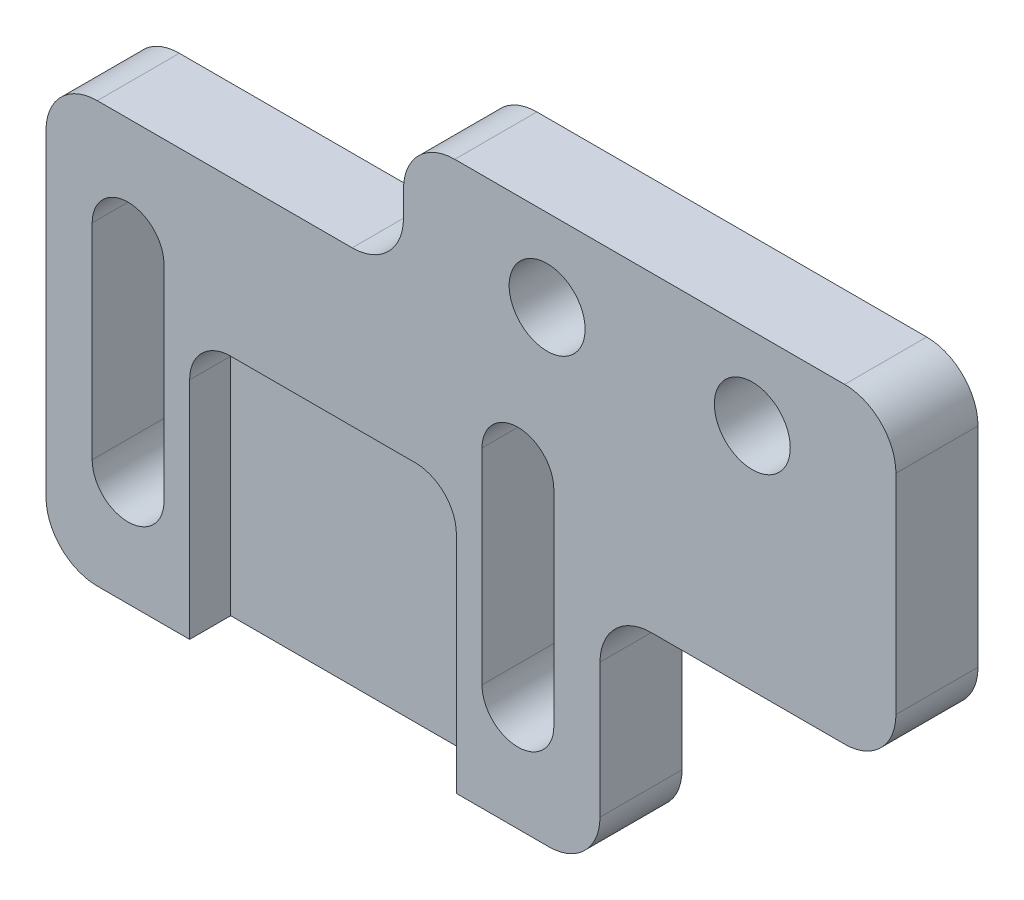
ISO-10303-21;
HEADER;
FILE_DESCRIPTION(('STEP AP214'),'2;1');
FILE_NAME('part.step','',(''),(''),'','','');
FILE_SCHEMA(('AUTOMOTIVE_DESIGN { 1 0 10303 214 1 1 1 1 }'));
ENDSEC;
DATA;
#1=APPLICATION_CONTEXT('core data for automotive mechanical design processes');
#2=APPLICATION_PROTOCOL_DEFINITION('international standard','automotive_design',2000,#1);
#3=PRODUCT_CONTEXT('',#1,'mechanical');
#4=PRODUCT('Part','Part','',(#3));
#5=PRODUCT_RELATED_PRODUCT_CATEGORY('part','',(#4));
#6=PRODUCT_DEFINITION_FORMATION('','',#4);
#7=PRODUCT_DEFINITION_CONTEXT('part definition',#1,'design');
#8=PRODUCT_DEFINITION('design','',#6,#7);
#9=PRODUCT_DEFINITION_SHAPE('','',#8);
#10=(LENGTH_UNIT() NAMED_UNIT(*) SI_UNIT(.MILLI.,.METRE.));
#11=(NAMED_UNIT(*) PLANE_ANGLE_UNIT() SI_UNIT($,.RADIAN.));
#12=(NAMED_UNIT(*) SI_UNIT($,.STERADIAN.) SOLID_ANGLE_UNIT());
#13=UNCERTAINTY_MEASURE_WITH_UNIT(LENGTH_MEASURE(1.E-05),#10,'distance_accuracy_value','');
#14=(GEOMETRIC_REPRESENTATION_CONTEXT(3) GLOBAL_UNCERTAINTY_ASSIGNED_CONTEXT((#13)) GLOBAL_UNIT_ASSIGNED_CONTEXT((#10,
#11,#12)) REPRESENTATION_CONTEXT('',''));
#15=CARTESIAN_POINT('',(0.,0.,0.));
#16=DIRECTION('',(0.,0.,1.));
#17=DIRECTION('',(1.,0.,0.));
#18=AXIS2_PLACEMENT_3D('',#15,#16,#17);
#19=CARTESIAN_POINT('',(0.,0.,4.));
#20=DIRECTION('',(0.,0.,1.));
#21=DIRECTION('',(1.,0.,0.));
#22=AXIS2_PLACEMENT_3D('',#19,#20,#21);
#23=PLANE('',#22);
#24=CARTESIAN_POINT('',(-5.,15.9743986874947,4.));
#25=DIRECTION('',(0.,0.,1.));
#26=DIRECTION('',(1.,0.,0.));
#27=AXIS2_PLACEMENT_3D('',#24,#25,#26);
#28=CIRCLE('',#27,1.85);
#29=CARTESIAN_POINT('',(-3.15,15.9743986874947,4.));
#30=VERTEX_POINT('',#29);
#31=EDGE_CURVE('E278',#30,#30,#28,.T.);
#32=ORIENTED_EDGE('',*,*,#31,.F.);
#33=EDGE_LOOP('',(#32));
#34=FACE_BOUND('',#33,.T.);
#35=CARTESIAN_POINT('',(5.,15.9743986874947,4.));
#36=DIRECTION('',(0.,0.,1.));
#37=DIRECTION('',(1.,0.,0.));
#38=AXIS2_PLACEMENT_3D('',#35,#36,#37);
#39=CIRCLE('',#38,1.85);
#40=CARTESIAN_POINT('',(6.85,15.9743986874947,4.));
#41=VERTEX_POINT('',#40);
#42=EDGE_CURVE('E471',#41,#41,#39,.T.);
#43=ORIENTED_EDGE('',*,*,#42,.F.);
#44=EDGE_LOOP('',(#43));
#45=FACE_BOUND('',#44,.T.);
#46=DIRECTION('',(0.,-1.,0.));
#47=VECTOR('',#46,1.);
#48=CARTESIAN_POINT('',(-8.17291465811631,8.45412353450726,4.));
#49=LINE('',#48,#47);
#50=CARTESIAN_POINT('',(-8.17291465811631,8.45412353450726,4.));
#51=VERTEX_POINT('',#50);
#52=CARTESIAN_POINT('',(-8.17291465811631,-1.54587646549274,4.));
#53=VERTEX_POINT('',#52);
#54=EDGE_CURVE('E442',#51,#53,#49,.T.);
#55=ORIENTED_EDGE('',*,*,#54,.F.);
#56=CARTESIAN_POINT('',(-6.42291465815889,8.45412353450726,4.));
#57=DIRECTION('',(0.,0.,1.));
#58=DIRECTION('',(1.,0.,0.));
#59=AXIS2_PLACEMENT_3D('',#56,#57,#58);
#60=CIRCLE('',#59,1.74999999995742);
#61=CARTESIAN_POINT('',(-4.67291465820148,8.45412353450726,4.));
#62=VERTEX_POINT('',#61);
#63=EDGE_CURVE('E440',#62,#51,#60,.T.);
#64=ORIENTED_EDGE('',*,*,#63,.F.);
#65=DIRECTION('',(0.,1.,0.));
#66=VECTOR('',#65,1.);
#67=CARTESIAN_POINT('',(-4.67291465820148,8.45412353450726,4.));
#68=LINE('',#67,#66);
#69=CARTESIAN_POINT('',(-4.67291465820147,-1.54587646549274,4.));
#70=VERTEX_POINT('',#69);
#71=EDGE_CURVE('E448',#70,#62,#68,.T.);
#72=ORIENTED_EDGE('',*,*,#71,.F.);
#73=CARTESIAN_POINT('',(-6.42291465815889,-1.54587646549274,4.));
#74=DIRECTION('',(0.,0.,1.));
#75=DIRECTION('',(1.,0.,0.));
#76=AXIS2_PLACEMENT_3D('',#73,#74,#75);
#77=CIRCLE('',#76,1.74999999995742);
#78=EDGE_CURVE('E445',#53,#70,#77,.T.);
#79=ORIENTED_EDGE('',*,*,#78,.F.);
#80=EDGE_LOOP('',(#55,#64,#72,#79));
#81=FACE_BOUND('',#80,.T.);
#82=DIRECTION('',(0.,-1.,0.));
#83=VECTOR('',#82,1.);
#84=CARTESIAN_POINT('',(-27.1729146581163,8.45412353450726,4.));
#85=LINE('',#84,#83);
#86=CARTESIAN_POINT('',(-27.1729146581163,8.45412353450726,4.));
#87=VERTEX_POINT('',#86);
#88=CARTESIAN_POINT('',(-27.1729146581163,-1.54587646549274,4.));
#89=VERTEX_POINT('',#88);
#90=EDGE_CURVE('E411',#87,#89,#85,.T.);
#91=ORIENTED_EDGE('',*,*,#90,.F.);
#92=CARTESIAN_POINT('',(-25.4229146581589,8.45412353450726,4.));
#93=DIRECTION('',(0.,0.,1.));
#94=DIRECTION('',(1.,0.,0.));
#95=AXIS2_PLACEMENT_3D('',#92,#93,#94);
#96=CIRCLE('',#95,1.74999999995742);
#97=CARTESIAN_POINT('',(-23.6729146582015,8.45412353450726,4.));
#98=VERTEX_POINT('',#97);
#99=EDGE_CURVE('E409',#98,#87,#96,.T.);
#100=ORIENTED_EDGE('',*,*,#99,.F.);
#101=DIRECTION('',(0.,1.,0.));
#102=VECTOR('',#101,1.);
#103=CARTESIAN_POINT('',(-23.6729146582015,8.45412353450726,4.));
#104=LINE('',#103,#102);
#105=CARTESIAN_POINT('',(-23.6729146582015,-1.54587646549274,4.));
#106=VERTEX_POINT('',#105);
#107=EDGE_CURVE('E417',#106,#98,#104,.T.);
#108=ORIENTED_EDGE('',*,*,#107,.F.);
#109=CARTESIAN_POINT('',(-25.4229146581589,-1.54587646549274,4.));
#110=DIRECTION('',(0.,0.,1.));
#111=DIRECTION('',(1.,0.,0.));
#112=AXIS2_PLACEMENT_3D('',#109,#110,#111);
#113=CIRCLE('',#112,1.74999999995742);
#114=EDGE_CURVE('E414',#89,#106,#113,.T.);
#115=ORIENTED_EDGE('',*,*,#114,.F.);
#116=EDGE_LOOP('',(#91,#100,#108,#115));
#117=FACE_BOUND('',#116,.T.);
#118=DIRECTION('',(0.,-1.,0.));
#119=VECTOR('',#118,1.);
#120=CARTESIAN_POINT('',(-22.4229146581589,6.20412353450726,4.));
#121=LINE('',#120,#119);
#122=CARTESIAN_POINT('',(-22.4229146581589,4.20412353450726,4.));
#123=VERTEX_POINT('',#122);
#124=CARTESIAN_POINT('',(-22.4229146581589,-6.75207768601638,4.));
#125=VERTEX_POINT('',#124);
#126=EDGE_CURVE('E230',#123,#125,#121,.T.);
#127=ORIENTED_EDGE('',*,*,#126,.F.);
#128=CARTESIAN_POINT('',(-20.4229146581589,4.20412353450726,4.));
#129=DIRECTION('',(0.,0.,1.));
#130=DIRECTION('',(1.,0.,0.));
#131=AXIS2_PLACEMENT_3D('',#128,#129,#130);
#132=CIRCLE('',#131,2.);
#133=CARTESIAN_POINT('',(-20.4229146581589,6.20412353450726,4.));
#134=VERTEX_POINT('',#133);
#135=EDGE_CURVE('E11',#123,#134,#132,.F.);
#136=ORIENTED_EDGE('',*,*,#135,.T.);
#137=DIRECTION('',(1.,0.,0.));
#138=VECTOR('',#137,1.);
#139=CARTESIAN_POINT('',(-22.4229146581589,6.20412353450726,4.));
#140=LINE('',#139,#138);
#141=CARTESIAN_POINT('',(-11.4229146581589,6.20412353450726,4.));
#142=VERTEX_POINT('',#141);
#143=EDGE_CURVE('E386',#134,#142,#140,.T.);
#144=ORIENTED_EDGE('',*,*,#143,.T.);
#145=CARTESIAN_POINT('',(-11.4229146581589,4.20412353450726,4.));
#146=DIRECTION('',(0.,0.,1.));
#147=DIRECTION('',(1.,0.,0.));
#148=AXIS2_PLACEMENT_3D('',#145,#146,#147);
#149=CIRCLE('',#148,2.);
#150=CARTESIAN_POINT('',(-9.42291465815889,4.20412353450726,4.));
#151=VERTEX_POINT('',#150);
#152=EDGE_CURVE('E41',#142,#151,#149,.F.);
#153=ORIENTED_EDGE('',*,*,#152,.T.);
#154=DIRECTION('',(0.,-1.,0.));
#155=VECTOR('',#154,1.);
#156=CARTESIAN_POINT('',(-9.42291465815889,6.20412353450726,4.));
#157=LINE('',#156,#155);
#158=CARTESIAN_POINT('',(-9.42291465815889,-6.75207768601638,4.));
#159=VERTEX_POINT('',#158);
#160=EDGE_CURVE('E239',#151,#159,#157,.T.);
#161=ORIENTED_EDGE('',*,*,#160,.T.);
#162=DIRECTION('',(1.,0.,0.));
#163=VECTOR('',#162,1.);
#164=CARTESIAN_POINT('',(-29.4229146581589,-6.75207768601638,4.));
#165=LINE('',#164,#163);
#166=CARTESIAN_POINT('',(-4.92291465815889,-6.75207768601638,4.));
#167=VERTEX_POINT('',#166);
#168=EDGE_CURVE('E256',#159,#167,#165,.T.);
#169=ORIENTED_EDGE('',*,*,#168,.T.);
#170=CARTESIAN_POINT('',(-4.92291465815889,-4.25207768601638,4.));
#171=DIRECTION('',(0.,0.,1.));
#172=DIRECTION('',(1.,0.,0.));
#173=AXIS2_PLACEMENT_3D('',#170,#171,#172);
#174=CIRCLE('',#173,2.5);
#175=CARTESIAN_POINT('',(-2.42291465815889,-4.25207768601638,4.));
#176=VERTEX_POINT('',#175);
#177=EDGE_CURVE('E328',#167,#176,#174,.T.);
#178=ORIENTED_EDGE('',*,*,#177,.T.);
#179=DIRECTION('',(0.,1.,0.));
#180=VECTOR('',#179,1.);
#181=CARTESIAN_POINT('',(-2.42291465815889,-6.75207768601638,4.));
#182=LINE('',#181,#180);
#183=CARTESIAN_POINT('',(-2.42291465815889,2.28793613416428,4.));
#184=VERTEX_POINT('',#183);
#185=EDGE_CURVE('E255',#176,#184,#182,.T.);
#186=ORIENTED_EDGE('',*,*,#185,.T.);
#187=CARTESIAN_POINT('',(0.0770853418411099,2.28793613416428,4.));
#188=DIRECTION('',(0.,0.,1.));
#189=DIRECTION('',(1.,0.,0.));
#190=AXIS2_PLACEMENT_3D('',#187,#188,#189);
#191=CIRCLE('',#190,2.5);
#192=CARTESIAN_POINT('',(0.0770853418411099,4.78793613416428,4.));
#193=VERTEX_POINT('',#192);
#194=EDGE_CURVE('E364',#184,#193,#191,.F.);
#195=ORIENTED_EDGE('',*,*,#194,.T.);
#196=DIRECTION('',(1.,0.,0.));
#197=VECTOR('',#196,1.);
#198=CARTESIAN_POINT('',(-2.42291465815889,4.78793613416428,4.));
#199=LINE('',#198,#197);
#200=CARTESIAN_POINT('',(9.5,4.78793613416428,4.));
#201=VERTEX_POINT('',#200);
#202=EDGE_CURVE('E259',#193,#201,#199,.T.);
#203=ORIENTED_EDGE('',*,*,#202,.T.);
#204=CARTESIAN_POINT('',(9.5,7.28793613416428,4.));
#205=DIRECTION('',(0.,0.,1.));
#206=DIRECTION('',(1.,0.,0.));
#207=AXIS2_PLACEMENT_3D('',#204,#205,#206);
#208=CIRCLE('',#207,2.5);
#209=CARTESIAN_POINT('',(12.,7.28793613416428,4.));
#210=VERTEX_POINT('',#209);
#211=EDGE_CURVE('E330',#201,#210,#208,.T.);
#212=ORIENTED_EDGE('',*,*,#211,.T.);
#213=DIRECTION('',(0.,1.,0.));
#214=VECTOR('',#213,1.);
#215=CARTESIAN_POINT('',(12.,19.9743986874947,4.));
#216=LINE('',#215,#214);
#217=CARTESIAN_POINT('',(12.,17.4743986874948,4.));
#218=VERTEX_POINT('',#217);
#219=EDGE_CURVE('E267',#210,#218,#216,.T.);
#220=ORIENTED_EDGE('',*,*,#219,.T.);
#221=CARTESIAN_POINT('',(9.5,17.4743986874948,4.));
#222=DIRECTION('',(0.,0.,1.));
#223=DIRECTION('',(1.,0.,0.));
#224=AXIS2_PLACEMENT_3D('',#221,#222,#223);
#225=CIRCLE('',#224,2.5);
#226=CARTESIAN_POINT('',(9.5,19.9743986874947,4.));
#227=VERTEX_POINT('',#226);
#228=EDGE_CURVE('E326',#218,#227,#225,.T.);
#229=ORIENTED_EDGE('',*,*,#228,.T.);
#230=DIRECTION('',(-1.,0.,0.));
#231=VECTOR('',#230,1.);
#232=CARTESIAN_POINT('',(-12.,19.9743986874947,4.));
#233=LINE('',#232,#231);
#234=CARTESIAN_POINT('',(-9.5,19.9743986874947,4.));
#235=VERTEX_POINT('',#234);
#236=EDGE_CURVE('E270',#227,#235,#233,.T.);
#237=ORIENTED_EDGE('',*,*,#236,.T.);
#238=CARTESIAN_POINT('',(-9.5,17.4743986874948,4.));
#239=DIRECTION('',(0.,0.,1.));
#240=DIRECTION('',(1.,0.,0.));
#241=AXIS2_PLACEMENT_3D('',#238,#239,#240);
#242=CIRCLE('',#241,2.5);
#243=CARTESIAN_POINT('',(-12.,17.4743986874948,4.));
#244=VERTEX_POINT('',#243);
#245=EDGE_CURVE('E324',#235,#244,#242,.T.);
#246=ORIENTED_EDGE('',*,*,#245,.T.);
#247=DIRECTION('',(0.,-1.,0.));
#248=VECTOR('',#247,1.);
#249=CARTESIAN_POINT('',(-12.,19.9743986874947,4.));
#250=LINE('',#249,#248);
#251=CARTESIAN_POINT('',(-12.,16.2384821002864,4.));
#252=VERTEX_POINT('',#251);
#253=EDGE_CURVE('E299',#244,#252,#250,.T.);
#254=ORIENTED_EDGE('',*,*,#253,.T.);
#255=CARTESIAN_POINT('',(-14.5,16.2384821002864,4.));
#256=DIRECTION('',(0.,0.,1.));
#257=DIRECTION('',(1.,0.,0.));
#258=AXIS2_PLACEMENT_3D('',#255,#256,#257);
#259=CIRCLE('',#258,2.5);
#260=CARTESIAN_POINT('',(-14.5,13.7384821002864,4.));
#261=VERTEX_POINT('',#260);
#262=EDGE_CURVE('E368',#252,#261,#259,.F.);
#263=ORIENTED_EDGE('',*,*,#262,.T.);
#264=DIRECTION('',(-1.,0.,0.));
#265=VECTOR('',#264,1.);
#266=CARTESIAN_POINT('',(-29.4229146581589,13.7384821002864,4.));
#267=LINE('',#266,#265);
#268=CARTESIAN_POINT('',(-26.9229146581589,13.7384821002864,4.));
#269=VERTEX_POINT('',#268);
#270=EDGE_CURVE('E482',#261,#269,#267,.T.);
#271=ORIENTED_EDGE('',*,*,#270,.T.);
#272=CARTESIAN_POINT('',(-26.9229146581589,11.2384821002864,4.));
#273=DIRECTION('',(0.,0.,1.));
#274=DIRECTION('',(1.,0.,0.));
#275=AXIS2_PLACEMENT_3D('',#272,#273,#274);
#276=CIRCLE('',#275,2.5);
#277=CARTESIAN_POINT('',(-29.4229146581589,11.2384821002864,4.));
#278=VERTEX_POINT('',#277);
#279=EDGE_CURVE('E322',#269,#278,#276,.T.);
#280=ORIENTED_EDGE('',*,*,#279,.T.);
#281=DIRECTION('',(0.,-1.,0.));
#282=VECTOR('',#281,1.);
#283=CARTESIAN_POINT('',(-29.4229146581589,-6.75207768601638,4.));
#284=LINE('',#283,#282);
#285=CARTESIAN_POINT('',(-29.4229146581589,-4.25207768601638,4.));
#286=VERTEX_POINT('',#285);
#287=EDGE_CURVE('E261',#278,#286,#284,.T.);
#288=ORIENTED_EDGE('',*,*,#287,.T.);
#289=CARTESIAN_POINT('',(-26.9229146581589,-4.25207768601638,4.));
#290=DIRECTION('',(0.,0.,1.));
#291=DIRECTION('',(1.,0.,0.));
#292=AXIS2_PLACEMENT_3D('',#289,#290,#291);
#293=CIRCLE('',#292,2.5);
#294=CARTESIAN_POINT('',(-26.9229146581589,-6.75207768601638,4.));
#295=VERTEX_POINT('',#294);
#296=EDGE_CURVE('E254',#286,#295,#293,.T.);
#297=ORIENTED_EDGE('',*,*,#296,.T.);
#298=EDGE_CURVE('E246',#295,#125,#165,.T.);
#299=ORIENTED_EDGE('',*,*,#298,.T.);
#300=EDGE_LOOP('',(#127,#136,#144,#153,#161,#169,#178,#186,#195,#203,#212,#220,#229,#237,#246,
#254,#263,#271,#280,#288,#297,#299));
#301=FACE_BOUND('',#300,.T.);
#302=ADVANCED_FACE('F33',(#34,#45,#81,#117,#301),#23,.T.);
#303=CARTESIAN_POINT('',(-29.4229146581589,-6.75207768601638,4.));
#304=DIRECTION('',(0.,1.,0.));
#305=DIRECTION('',(-1.,0.,0.));
#306=AXIS2_PLACEMENT_3D('',#303,#304,#305);
#307=PLANE('',#306);
#308=DIRECTION('',(0.,0.,1.));
#309=VECTOR('',#308,1.);
#310=CARTESIAN_POINT('',(-9.42291465815889,-6.75207768601638,4.));
#311=LINE('',#310,#309);
#312=CARTESIAN_POINT('',(-9.42291465815889,-6.75207768601638,2.));
#313=VERTEX_POINT('',#312);
#314=EDGE_CURVE('E250',#313,#159,#311,.T.);
#315=ORIENTED_EDGE('',*,*,#314,.F.);
#316=DIRECTION('',(-1.,0.,0.));
#317=VECTOR('',#316,1.);
#318=CARTESIAN_POINT('',(-29.4229146581589,-6.75207768601638,2.));
#319=LINE('',#318,#317);
#320=CARTESIAN_POINT('',(-22.4229146581589,-6.75207768601638,2.));
#321=VERTEX_POINT('',#320);
#322=EDGE_CURVE('E249',#313,#321,#319,.T.);
#323=ORIENTED_EDGE('',*,*,#322,.T.);
#324=DIRECTION('',(0.,0.,1.));
#325=VECTOR('',#324,1.);
#326=CARTESIAN_POINT('',(-22.4229146581589,-6.75207768601638,4.));
#327=LINE('',#326,#325);
#328=EDGE_CURVE('E233',#321,#125,#327,.T.);
#329=ORIENTED_EDGE('',*,*,#328,.T.);
#330=ORIENTED_EDGE('',*,*,#298,.F.);
#331=DIRECTION('',(0.,0.,-1.));
#332=VECTOR('',#331,1.);
#333=CARTESIAN_POINT('',(-26.9229146581589,-6.75207768601638,4.));
#334=LINE('',#333,#332);
#335=CARTESIAN_POINT('',(-26.9229146581589,-6.75207768601638,0.));
#336=VERTEX_POINT('',#335);
#337=EDGE_CURVE('E337',#295,#336,#334,.T.);
#338=ORIENTED_EDGE('',*,*,#337,.T.);
#339=DIRECTION('',(1.,0.,0.));
#340=VECTOR('',#339,1.);
#341=CARTESIAN_POINT('',(-29.4229146581589,-6.75207768601638,0.));
#342=LINE('',#341,#340);
#343=CARTESIAN_POINT('',(-4.92291465815889,-6.75207768601638,0.));
#344=VERTEX_POINT('',#343);
#345=EDGE_CURVE('E284',#336,#344,#342,.T.);
#346=ORIENTED_EDGE('',*,*,#345,.T.);
#347=DIRECTION('',(0.,0.,-1.));
#348=VECTOR('',#347,1.);
#349=CARTESIAN_POINT('',(-4.92291465815889,-6.75207768601638,4.));
#350=LINE('',#349,#348);
#351=EDGE_CURVE('E339',#344,#167,#350,.F.);
#352=ORIENTED_EDGE('',*,*,#351,.T.);
#353=ORIENTED_EDGE('',*,*,#168,.F.);
#354=EDGE_LOOP('',(#315,#323,#329,#330,#338,#346,#352,#353));
#355=FACE_BOUND('',#354,.T.);
#356=ADVANCED_FACE('F244',(#355),#307,.F.);
#357=CARTESIAN_POINT('',(0.,0.,0.));
#358=DIRECTION('',(0.,0.,1.));
#359=DIRECTION('',(1.,0.,0.));
#360=AXIS2_PLACEMENT_3D('',#357,#358,#359);
#361=PLANE('',#360);
#362=CARTESIAN_POINT('',(-6.42291465815889,8.45412353450726,0.));
#363=DIRECTION('',(0.,0.,1.));
#364=DIRECTION('',(1.,0.,0.));
#365=AXIS2_PLACEMENT_3D('',#362,#363,#364);
#366=CIRCLE('',#365,1.74999999995742);
#367=CARTESIAN_POINT('',(-4.67291465820148,8.45412353450726,0.));
#368=VERTEX_POINT('',#367);
#369=CARTESIAN_POINT('',(-8.17291465811631,8.45412353450726,0.));
#370=VERTEX_POINT('',#369);
#371=EDGE_CURVE('E439',#368,#370,#366,.T.);
#372=ORIENTED_EDGE('',*,*,#371,.T.);
#373=DIRECTION('',(0.,-1.,0.));
#374=VECTOR('',#373,1.);
#375=CARTESIAN_POINT('',(-8.17291465811631,8.45412353450726,0.));
#376=LINE('',#375,#374);
#377=CARTESIAN_POINT('',(-8.17291465811631,-1.54587646549274,0.));
#378=VERTEX_POINT('',#377);
#379=EDGE_CURVE('E453',#370,#378,#376,.T.);
#380=ORIENTED_EDGE('',*,*,#379,.T.);
#381=CARTESIAN_POINT('',(-6.42291465815889,-1.54587646549274,0.));
#382=DIRECTION('',(0.,0.,1.));
#383=DIRECTION('',(1.,0.,0.));
#384=AXIS2_PLACEMENT_3D('',#381,#382,#383);
#385=CIRCLE('',#384,1.74999999995742);
#386=CARTESIAN_POINT('',(-4.67291465820147,-1.54587646549274,0.));
#387=VERTEX_POINT('',#386);
#388=EDGE_CURVE('E456',#378,#387,#385,.T.);
#389=ORIENTED_EDGE('',*,*,#388,.T.);
#390=DIRECTION('',(0.,1.,0.));
#391=VECTOR('',#390,1.);
#392=CARTESIAN_POINT('',(-4.67291465820148,8.45412353450726,0.));
#393=LINE('',#392,#391);
#394=EDGE_CURVE('E443',#387,#368,#393,.T.);
#395=ORIENTED_EDGE('',*,*,#394,.T.);
#396=EDGE_LOOP('',(#372,#380,#389,#395));
#397=FACE_BOUND('',#396,.T.);
#398=DIRECTION('',(0.,1.,0.));
#399=VECTOR('',#398,1.);
#400=CARTESIAN_POINT('',(12.,19.9743986874947,0.));
#401=LINE('',#400,#399);
#402=CARTESIAN_POINT('',(12.,7.28793613416428,0.));
#403=VERTEX_POINT('',#402);
#404=CARTESIAN_POINT('',(12.,17.4743986874948,0.));
#405=VERTEX_POINT('',#404);
#406=EDGE_CURVE('E293',#403,#405,#401,.T.);
#407=ORIENTED_EDGE('',*,*,#406,.F.);
#408=CARTESIAN_POINT('',(9.5,7.28793613416428,0.));
#409=DIRECTION('',(0.,0.,1.));
#410=DIRECTION('',(1.,0.,0.));
#411=AXIS2_PLACEMENT_3D('',#408,#409,#410);
#412=CIRCLE('',#411,2.5);
#413=CARTESIAN_POINT('',(9.5,4.78793613416428,0.));
#414=VERTEX_POINT('',#413);
#415=EDGE_CURVE('E314',#403,#414,#412,.F.);
#416=ORIENTED_EDGE('',*,*,#415,.T.);
#417=DIRECTION('',(1.,0.,0.));
#418=VECTOR('',#417,1.);
#419=CARTESIAN_POINT('',(-2.42291465815889,4.78793613416428,0.));
#420=LINE('',#419,#418);
#421=CARTESIAN_POINT('',(0.0770853418411099,4.78793613416428,0.));
#422=VERTEX_POINT('',#421);
#423=EDGE_CURVE('E290',#422,#414,#420,.T.);
#424=ORIENTED_EDGE('',*,*,#423,.F.);
#425=CARTESIAN_POINT('',(0.0770853418411099,2.28793613416428,0.));
#426=DIRECTION('',(0.,0.,1.));
#427=DIRECTION('',(1.,0.,0.));
#428=AXIS2_PLACEMENT_3D('',#425,#426,#427);
#429=CIRCLE('',#428,2.5);
#430=CARTESIAN_POINT('',(-2.42291465815889,2.28793613416428,0.));
#431=VERTEX_POINT('',#430);
#432=EDGE_CURVE('E362',#422,#431,#429,.T.);
#433=ORIENTED_EDGE('',*,*,#432,.T.);
#434=DIRECTION('',(0.,1.,0.));
#435=VECTOR('',#434,1.);
#436=CARTESIAN_POINT('',(-2.42291465815889,-6.75207768601638,0.));
#437=LINE('',#436,#435);
#438=CARTESIAN_POINT('',(-2.42291465815889,-4.25207768601638,0.));
#439=VERTEX_POINT('',#438);
#440=EDGE_CURVE('E287',#439,#431,#437,.T.);
#441=ORIENTED_EDGE('',*,*,#440,.F.);
#442=CARTESIAN_POINT('',(-4.92291465815889,-4.25207768601638,0.));
#443=DIRECTION('',(0.,0.,1.));
#444=DIRECTION('',(1.,0.,0.));
#445=AXIS2_PLACEMENT_3D('',#442,#443,#444);
#446=CIRCLE('',#445,2.5);
#447=EDGE_CURVE('E312',#439,#344,#446,.F.);
#448=ORIENTED_EDGE('',*,*,#447,.T.);
#449=ORIENTED_EDGE('',*,*,#345,.F.);
#450=CARTESIAN_POINT('',(-26.9229146581589,-4.25207768601638,0.));
#451=DIRECTION('',(0.,0.,1.));
#452=DIRECTION('',(1.,0.,0.));
#453=AXIS2_PLACEMENT_3D('',#450,#451,#452);
#454=CIRCLE('',#453,2.5);
#455=CARTESIAN_POINT('',(-29.4229146581589,-4.25207768601638,0.));
#456=VERTEX_POINT('',#455);
#457=EDGE_CURVE('E304',#336,#456,#454,.F.);
#458=ORIENTED_EDGE('',*,*,#457,.T.);
#459=DIRECTION('',(0.,-1.,0.));
#460=VECTOR('',#459,1.);
#461=CARTESIAN_POINT('',(-29.4229146581589,-6.75207768601638,0.));
#462=LINE('',#461,#460);
#463=CARTESIAN_POINT('',(-29.4229146581589,11.2384821002864,0.));
#464=VERTEX_POINT('',#463);
#465=EDGE_CURVE('E281',#464,#456,#462,.T.);
#466=ORIENTED_EDGE('',*,*,#465,.F.);
#467=CARTESIAN_POINT('',(-26.9229146581589,11.2384821002864,0.));
#468=DIRECTION('',(0.,0.,1.));
#469=DIRECTION('',(1.,0.,0.));
#470=AXIS2_PLACEMENT_3D('',#467,#468,#469);
#471=CIRCLE('',#470,2.5);
#472=CARTESIAN_POINT('',(-26.9229146581589,13.7384821002864,0.));
#473=VERTEX_POINT('',#472);
#474=EDGE_CURVE('E306',#464,#473,#471,.F.);
#475=ORIENTED_EDGE('',*,*,#474,.T.);
#476=DIRECTION('',(-1.,0.,0.));
#477=VECTOR('',#476,1.);
#478=CARTESIAN_POINT('',(-29.4229146581589,13.7384821002864,0.));
#479=LINE('',#478,#477);
#480=CARTESIAN_POINT('',(-14.5,13.7384821002864,0.));
#481=VERTEX_POINT('',#480);
#482=EDGE_CURVE('E277',#481,#473,#479,.T.);
#483=ORIENTED_EDGE('',*,*,#482,.F.);
#484=CARTESIAN_POINT('',(-14.5,16.2384821002864,0.));
#485=DIRECTION('',(0.,0.,1.));
#486=DIRECTION('',(1.,0.,0.));
#487=AXIS2_PLACEMENT_3D('',#484,#485,#486);
#488=CIRCLE('',#487,2.5);
#489=CARTESIAN_POINT('',(-12.,16.2384821002864,0.));
#490=VERTEX_POINT('',#489);
#491=EDGE_CURVE('E366',#481,#490,#488,.T.);
#492=ORIENTED_EDGE('',*,*,#491,.T.);
#493=DIRECTION('',(0.,-1.,0.));
#494=VECTOR('',#493,1.);
#495=CARTESIAN_POINT('',(-12.,19.9743986874947,0.));
#496=LINE('',#495,#494);
#497=CARTESIAN_POINT('',(-12.,17.4743986874948,0.));
#498=VERTEX_POINT('',#497);
#499=EDGE_CURVE('E274',#498,#490,#496,.T.);
#500=ORIENTED_EDGE('',*,*,#499,.F.);
#501=CARTESIAN_POINT('',(-9.5,17.4743986874948,0.));
#502=DIRECTION('',(0.,0.,1.));
#503=DIRECTION('',(1.,0.,0.));
#504=AXIS2_PLACEMENT_3D('',#501,#502,#503);
#505=CIRCLE('',#504,2.5);
#506=CARTESIAN_POINT('',(-9.5,19.9743986874947,0.));
#507=VERTEX_POINT('',#506);
#508=EDGE_CURVE('E308',#498,#507,#505,.F.);
#509=ORIENTED_EDGE('',*,*,#508,.T.);
#510=DIRECTION('',(-1.,0.,0.));
#511=VECTOR('',#510,1.);
#512=CARTESIAN_POINT('',(-12.,19.9743986874947,0.));
#513=LINE('',#512,#511);
#514=CARTESIAN_POINT('',(9.5,19.9743986874947,0.));
#515=VERTEX_POINT('',#514);
#516=EDGE_CURVE('E296',#515,#507,#513,.T.);
#517=ORIENTED_EDGE('',*,*,#516,.F.);
#518=CARTESIAN_POINT('',(9.5,17.4743986874948,0.));
#519=DIRECTION('',(0.,0.,1.));
#520=DIRECTION('',(1.,0.,0.));
#521=AXIS2_PLACEMENT_3D('',#518,#519,#520);
#522=CIRCLE('',#521,2.5);
#523=EDGE_CURVE('E310',#515,#405,#522,.F.);
#524=ORIENTED_EDGE('',*,*,#523,.T.);
#525=EDGE_LOOP('',(#407,#416,#424,#433,#441,#448,#449,#458,#466,#475,#483,#492,#500,#509,#517,#524));
#526=FACE_BOUND('',#525,.T.);
#527=CARTESIAN_POINT('',(-5.,15.9743986874947,0.));
#528=DIRECTION('',(0.,0.,1.));
#529=DIRECTION('',(1.,0.,0.));
#530=AXIS2_PLACEMENT_3D('',#527,#528,#529);
#531=CIRCLE('',#530,1.85);
#532=CARTESIAN_POINT('',(-3.15,15.9743986874947,0.));
#533=VERTEX_POINT('',#532);
#534=EDGE_CURVE('E474',#533,#533,#531,.T.);
#535=ORIENTED_EDGE('',*,*,#534,.T.);
#536=EDGE_LOOP('',(#535));
#537=FACE_BOUND('',#536,.T.);
#538=CARTESIAN_POINT('',(5.,15.9743986874947,0.));
#539=DIRECTION('',(0.,0.,1.));
#540=DIRECTION('',(1.,0.,0.));
#541=AXIS2_PLACEMENT_3D('',#538,#539,#540);
#542=CIRCLE('',#541,1.85);
#543=CARTESIAN_POINT('',(6.85,15.9743986874947,0.));
#544=VERTEX_POINT('',#543);
#545=EDGE_CURVE('E470',#544,#544,#542,.T.);
#546=ORIENTED_EDGE('',*,*,#545,.T.);
#547=EDGE_LOOP('',(#546));
#548=FACE_BOUND('',#547,.T.);
#549=CARTESIAN_POINT('',(-25.4229146581589,8.45412353450726,0.));
#550=DIRECTION('',(0.,0.,1.));
#551=DIRECTION('',(1.,0.,0.));
#552=AXIS2_PLACEMENT_3D('',#549,#550,#551);
#553=CIRCLE('',#552,1.74999999995742);
#554=CARTESIAN_POINT('',(-23.6729146582015,8.45412353450726,0.));
#555=VERTEX_POINT('',#554);
#556=CARTESIAN_POINT('',(-27.1729146581163,8.45412353450726,0.));
#557=VERTEX_POINT('',#556);
#558=EDGE_CURVE('E407',#555,#557,#553,.T.);
#559=ORIENTED_EDGE('',*,*,#558,.T.);
#560=DIRECTION('',(0.,-1.,0.));
#561=VECTOR('',#560,1.);
#562=CARTESIAN_POINT('',(-27.1729146581163,8.45412353450726,0.));
#563=LINE('',#562,#561);
#564=CARTESIAN_POINT('',(-27.1729146581163,-1.54587646549274,0.));
#565=VERTEX_POINT('',#564);
#566=EDGE_CURVE('E422',#557,#565,#563,.T.);
#567=ORIENTED_EDGE('',*,*,#566,.T.);
#568=CARTESIAN_POINT('',(-25.4229146581589,-1.54587646549274,0.));
#569=DIRECTION('',(0.,0.,1.));
#570=DIRECTION('',(1.,0.,0.));
#571=AXIS2_PLACEMENT_3D('',#568,#569,#570);
#572=CIRCLE('',#571,1.74999999995742);
#573=CARTESIAN_POINT('',(-23.6729146582015,-1.54587646549274,0.));
#574=VERTEX_POINT('',#573);
#575=EDGE_CURVE('E425',#565,#574,#572,.T.);
#576=ORIENTED_EDGE('',*,*,#575,.T.);
#577=DIRECTION('',(0.,1.,0.));
#578=VECTOR('',#577,1.);
#579=CARTESIAN_POINT('',(-23.6729146582015,8.45412353450726,0.));
#580=LINE('',#579,#578);
#581=EDGE_CURVE('E412',#574,#555,#580,.T.);
#582=ORIENTED_EDGE('',*,*,#581,.T.);
#583=EDGE_LOOP('',(#559,#567,#576,#582));
#584=FACE_BOUND('',#583,.T.);
#585=ADVANCED_FACE('F496',(#397,#526,#537,#548,#584),#361,.F.);
#586=CARTESIAN_POINT('',(-12.,19.9743986874947,4.));
#587=DIRECTION('',(1.,0.,0.));
#588=DIRECTION('',(0.,0.,-1.));
#589=AXIS2_PLACEMENT_3D('',#586,#587,#588);
#590=PLANE('',#589);
#591=ORIENTED_EDGE('',*,*,#253,.F.);
#592=DIRECTION('',(0.,0.,-1.));
#593=VECTOR('',#592,1.);
#594=CARTESIAN_POINT('',(-12.,17.4743986874948,4.));
#595=LINE('',#594,#593);
#596=EDGE_CURVE('E349',#244,#498,#595,.T.);
#597=ORIENTED_EDGE('',*,*,#596,.T.);
#598=ORIENTED_EDGE('',*,*,#499,.T.);
#599=DIRECTION('',(0.,0.,-1.));
#600=VECTOR('',#599,1.);
#601=CARTESIAN_POINT('',(-12.,16.2384821002864,4.));
#602=LINE('',#601,#600);
#603=EDGE_CURVE('E347',#490,#252,#602,.F.);
#604=ORIENTED_EDGE('',*,*,#603,.T.);
#605=EDGE_LOOP('',(#591,#597,#598,#604));
#606=FACE_BOUND('',#605,.T.);
#607=ADVANCED_FACE('F541',(#606),#590,.F.);
#608=CARTESIAN_POINT('',(-29.4229146581589,13.7384821002864,4.));
#609=DIRECTION('',(0.,-1.,0.));
#610=DIRECTION('',(0.,0.,-1.));
#611=AXIS2_PLACEMENT_3D('',#608,#609,#610);
#612=PLANE('',#611);
#613=ORIENTED_EDGE('',*,*,#270,.F.);
#614=DIRECTION('',(0.,0.,-1.));
#615=VECTOR('',#614,1.);
#616=CARTESIAN_POINT('',(-14.5,13.7384821002864,0.));
#617=LINE('',#616,#615);
#618=EDGE_CURVE('E354',#261,#481,#617,.T.);
#619=ORIENTED_EDGE('',*,*,#618,.T.);
#620=ORIENTED_EDGE('',*,*,#482,.T.);
#621=DIRECTION('',(0.,0.,-1.));
#622=VECTOR('',#621,1.);
#623=CARTESIAN_POINT('',(-26.9229146581589,13.7384821002864,4.));
#624=LINE('',#623,#622);
#625=EDGE_CURVE('E352',#473,#269,#624,.F.);
#626=ORIENTED_EDGE('',*,*,#625,.T.);
#627=EDGE_LOOP('',(#613,#619,#620,#626));
#628=FACE_BOUND('',#627,.T.);
#629=ADVANCED_FACE('F549',(#628),#612,.F.);
#630=CARTESIAN_POINT('',(-29.4229146581589,-6.75207768601638,4.));
#631=DIRECTION('',(1.,0.,0.));
#632=DIRECTION('',(0.,0.,-1.));
#633=AXIS2_PLACEMENT_3D('',#630,#631,#632);
#634=PLANE('',#633);
#635=ORIENTED_EDGE('',*,*,#287,.F.);
#636=DIRECTION('',(0.,0.,-1.));
#637=VECTOR('',#636,1.);
#638=CARTESIAN_POINT('',(-29.4229146581589,11.2384821002864,4.));
#639=LINE('',#638,#637);
#640=EDGE_CURVE('E359',#278,#464,#639,.T.);
#641=ORIENTED_EDGE('',*,*,#640,.T.);
#642=ORIENTED_EDGE('',*,*,#465,.T.);
#643=DIRECTION('',(0.,0.,-1.));
#644=VECTOR('',#643,1.);
#645=CARTESIAN_POINT('',(-29.4229146581589,-4.25207768601638,4.));
#646=LINE('',#645,#644);
#647=EDGE_CURVE('E357',#456,#286,#646,.F.);
#648=ORIENTED_EDGE('',*,*,#647,.T.);
#649=EDGE_LOOP('',(#635,#641,#642,#648));
#650=FACE_BOUND('',#649,.T.);
#651=ADVANCED_FACE('F553',(#650),#634,.F.);
#652=CARTESIAN_POINT('',(-2.42291465815889,-6.75207768601638,4.));
#653=DIRECTION('',(-1.,0.,0.));
#654=DIRECTION('',(0.,0.,1.));
#655=AXIS2_PLACEMENT_3D('',#652,#653,#654);
#656=PLANE('',#655);
#657=ORIENTED_EDGE('',*,*,#185,.F.);
#658=DIRECTION('',(0.,0.,-1.));
#659=VECTOR('',#658,1.);
#660=CARTESIAN_POINT('',(-2.42291465815889,-4.25207768601638,4.));
#661=LINE('',#660,#659);
#662=EDGE_CURVE('E334',#176,#439,#661,.T.);
#663=ORIENTED_EDGE('',*,*,#662,.T.);
#664=ORIENTED_EDGE('',*,*,#440,.T.);
#665=DIRECTION('',(0.,0.,-1.));
#666=VECTOR('',#665,1.);
#667=CARTESIAN_POINT('',(-2.42291465815889,2.28793613416428,4.));
#668=LINE('',#667,#666);
#669=EDGE_CURVE('E332',#431,#184,#668,.F.);
#670=ORIENTED_EDGE('',*,*,#669,.T.);
#671=EDGE_LOOP('',(#657,#663,#664,#670));
#672=FACE_BOUND('',#671,.T.);
#673=ADVANCED_FACE('F506',(#672),#656,.F.);
#674=CARTESIAN_POINT('',(-2.42291465815889,4.78793613416428,4.));
#675=DIRECTION('',(0.,1.,0.));
#676=DIRECTION('',(0.,0.,1.));
#677=AXIS2_PLACEMENT_3D('',#674,#675,#676);
#678=PLANE('',#677);
#679=ORIENTED_EDGE('',*,*,#423,.T.);
#680=DIRECTION('',(0.,0.,-1.));
#681=VECTOR('',#680,1.);
#682=CARTESIAN_POINT('',(9.5,4.78793613416428,4.));
#683=LINE('',#682,#681);
#684=EDGE_CURVE('E319',#414,#201,#683,.F.);
#685=ORIENTED_EDGE('',*,*,#684,.T.);
#686=ORIENTED_EDGE('',*,*,#202,.F.);
#687=DIRECTION('',(0.,0.,-1.));
#688=VECTOR('',#687,1.);
#689=CARTESIAN_POINT('',(0.0770853418411099,4.78793613416428,0.));
#690=LINE('',#689,#688);
#691=EDGE_CURVE('E316',#193,#422,#690,.T.);
#692=ORIENTED_EDGE('',*,*,#691,.T.);
#693=EDGE_LOOP('',(#679,#685,#686,#692));
#694=FACE_BOUND('',#693,.T.);
#695=ADVANCED_FACE('F515',(#694),#678,.F.);
#696=CARTESIAN_POINT('',(12.,19.9743986874947,4.));
#697=DIRECTION('',(-1.,0.,0.));
#698=DIRECTION('',(0.,0.,1.));
#699=AXIS2_PLACEMENT_3D('',#696,#697,#698);
#700=PLANE('',#699);
#701=ORIENTED_EDGE('',*,*,#219,.F.);
#702=DIRECTION('',(0.,0.,-1.));
#703=VECTOR('',#702,1.);
#704=CARTESIAN_POINT('',(12.,7.28793613416428,4.));
#705=LINE('',#704,#703);
#706=EDGE_CURVE('E301',#210,#403,#705,.T.);
#707=ORIENTED_EDGE('',*,*,#706,.T.);
#708=ORIENTED_EDGE('',*,*,#406,.T.);
#709=DIRECTION('',(0.,0.,-1.));
#710=VECTOR('',#709,1.);
#711=CARTESIAN_POINT('',(12.,17.4743986874948,4.));
#712=LINE('',#711,#710);
#713=EDGE_CURVE('E273',#405,#218,#712,.F.);
#714=ORIENTED_EDGE('',*,*,#713,.T.);
#715=EDGE_LOOP('',(#701,#707,#708,#714));
#716=FACE_BOUND('',#715,.T.);
#717=ADVANCED_FACE('F523',(#716),#700,.F.);
#718=CARTESIAN_POINT('',(-12.,19.9743986874947,4.));
#719=DIRECTION('',(0.,-1.,0.));
#720=DIRECTION('',(0.,0.,-1.));
#721=AXIS2_PLACEMENT_3D('',#718,#719,#720);
#722=PLANE('',#721);
#723=ORIENTED_EDGE('',*,*,#236,.F.);
#724=DIRECTION('',(0.,0.,-1.));
#725=VECTOR('',#724,1.);
#726=CARTESIAN_POINT('',(9.5,19.9743986874947,4.));
#727=LINE('',#726,#725);
#728=EDGE_CURVE('E344',#227,#515,#727,.T.);
#729=ORIENTED_EDGE('',*,*,#728,.T.);
#730=ORIENTED_EDGE('',*,*,#516,.T.);
#731=DIRECTION('',(0.,0.,-1.));
#732=VECTOR('',#731,1.);
#733=CARTESIAN_POINT('',(-9.5,19.9743986874947,4.));
#734=LINE('',#733,#732);
#735=EDGE_CURVE('E342',#507,#235,#734,.F.);
#736=ORIENTED_EDGE('',*,*,#735,.T.);
#737=EDGE_LOOP('',(#723,#729,#730,#736));
#738=FACE_BOUND('',#737,.T.);
#739=ADVANCED_FACE('F532',(#738),#722,.F.);
#740=CARTESIAN_POINT('',(-5.,15.9743986874947,4.));
#741=DIRECTION('',(0.,0.,-1.));
#742=DIRECTION('',(-1.,0.,0.));
#743=AXIS2_PLACEMENT_3D('',#740,#741,#742);
#744=CYLINDRICAL_SURFACE('',#743,1.85);
#745=ORIENTED_EDGE('',*,*,#31,.T.);
#746=EDGE_LOOP('',(#745));
#747=FACE_BOUND('',#746,.T.);
#748=ORIENTED_EDGE('',*,*,#534,.F.);
#749=EDGE_LOOP('',(#748));
#750=FACE_BOUND('',#749,.T.);
#751=ADVANCED_FACE('F573',(#747,#750),#744,.F.);
#752=CARTESIAN_POINT('',(5.,15.9743986874947,4.));
#753=DIRECTION('',(0.,0.,-1.));
#754=DIRECTION('',(-1.,0.,0.));
#755=AXIS2_PLACEMENT_3D('',#752,#753,#754);
#756=CYLINDRICAL_SURFACE('',#755,1.85);
#757=ORIENTED_EDGE('',*,*,#42,.T.);
#758=EDGE_LOOP('',(#757));
#759=FACE_BOUND('',#758,.T.);
#760=ORIENTED_EDGE('',*,*,#545,.F.);
#761=EDGE_LOOP('',(#760));
#762=FACE_BOUND('',#761,.T.);
#763=ADVANCED_FACE('F602',(#759,#762),#756,.F.);
#764=CARTESIAN_POINT('',(-6.42291465815889,8.45412353450726,4.));
#765=DIRECTION('',(0.,0.,-1.));
#766=DIRECTION('',(-1.,0.,0.));
#767=AXIS2_PLACEMENT_3D('',#764,#765,#766);
#768=CYLINDRICAL_SURFACE('',#767,1.74999999995742);
#769=ORIENTED_EDGE('',*,*,#371,.F.);
#770=DIRECTION('',(0.,0.,-1.));
#771=VECTOR('',#770,1.);
#772=CARTESIAN_POINT('',(-4.67291465820148,8.45412353450726,4.));
#773=LINE('',#772,#771);
#774=EDGE_CURVE('E450',#62,#368,#773,.T.);
#775=ORIENTED_EDGE('',*,*,#774,.F.);
#776=ORIENTED_EDGE('',*,*,#63,.T.);
#777=DIRECTION('',(0.,0.,-1.));
#778=VECTOR('',#777,1.);
#779=CARTESIAN_POINT('',(-8.17291465811631,8.45412353450726,4.));
#780=LINE('',#779,#778);
#781=EDGE_CURVE('E467',#51,#370,#780,.T.);
#782=ORIENTED_EDGE('',*,*,#781,.T.);
#783=EDGE_LOOP('',(#769,#775,#776,#782));
#784=FACE_BOUND('',#783,.T.);
#785=ADVANCED_FACE('F609',(#784),#768,.F.);
#786=CARTESIAN_POINT('',(-8.17291465811631,8.45412353450726,4.));
#787=DIRECTION('',(1.,0.,0.));
#788=DIRECTION('',(0.,0.,-1.));
#789=AXIS2_PLACEMENT_3D('',#786,#787,#788);
#790=PLANE('',#789);
#791=ORIENTED_EDGE('',*,*,#379,.F.);
#792=ORIENTED_EDGE('',*,*,#781,.F.);
#793=ORIENTED_EDGE('',*,*,#54,.T.);
#794=DIRECTION('',(0.,0.,-1.));
#795=VECTOR('',#794,1.);
#796=CARTESIAN_POINT('',(-8.17291465811631,-1.54587646549274,4.));
#797=LINE('',#796,#795);
#798=EDGE_CURVE('E465',#53,#378,#797,.T.);
#799=ORIENTED_EDGE('',*,*,#798,.T.);
#800=EDGE_LOOP('',(#791,#792,#793,#799));
#801=FACE_BOUND('',#800,.T.);
#802=ADVANCED_FACE('F616',(#801),#790,.T.);
#803=CARTESIAN_POINT('',(-6.42291465815889,-1.54587646549274,4.));
#804=DIRECTION('',(0.,0.,-1.));
#805=DIRECTION('',(-1.,0.,0.));
#806=AXIS2_PLACEMENT_3D('',#803,#804,#805);
#807=CYLINDRICAL_SURFACE('',#806,1.74999999995742);
#808=ORIENTED_EDGE('',*,*,#388,.F.);
#809=ORIENTED_EDGE('',*,*,#798,.F.);
#810=ORIENTED_EDGE('',*,*,#78,.T.);
#811=DIRECTION('',(0.,0.,-1.));
#812=VECTOR('',#811,1.);
#813=CARTESIAN_POINT('',(-4.67291465820147,-1.54587646549274,4.));
#814=LINE('',#813,#812);
#815=EDGE_CURVE('E463',#70,#387,#814,.T.);
#816=ORIENTED_EDGE('',*,*,#815,.T.);
#817=EDGE_LOOP('',(#808,#809,#810,#816));
#818=FACE_BOUND('',#817,.T.);
#819=ADVANCED_FACE('F624',(#818),#807,.F.);
#820=CARTESIAN_POINT('',(-4.67291465820148,8.45412353450726,4.));
#821=DIRECTION('',(-1.,0.,0.));
#822=DIRECTION('',(0.,-1.,0.));
#823=AXIS2_PLACEMENT_3D('',#820,#821,#822);
#824=PLANE('',#823);
#825=ORIENTED_EDGE('',*,*,#394,.F.);
#826=ORIENTED_EDGE('',*,*,#815,.F.);
#827=ORIENTED_EDGE('',*,*,#71,.T.);
#828=ORIENTED_EDGE('',*,*,#774,.T.);
#829=EDGE_LOOP('',(#825,#826,#827,#828));
#830=FACE_BOUND('',#829,.T.);
#831=ADVANCED_FACE('F632',(#830),#824,.T.);
#832=CARTESIAN_POINT('',(-25.4229146581589,8.45412353450726,4.));
#833=DIRECTION('',(0.,0.,-1.));
#834=DIRECTION('',(-1.,0.,0.));
#835=AXIS2_PLACEMENT_3D('',#832,#833,#834);
#836=CYLINDRICAL_SURFACE('',#835,1.74999999995742);
#837=ORIENTED_EDGE('',*,*,#558,.F.);
#838=DIRECTION('',(0.,0.,-1.));
#839=VECTOR('',#838,1.);
#840=CARTESIAN_POINT('',(-23.6729146582015,8.45412353450726,4.));
#841=LINE('',#840,#839);
#842=EDGE_CURVE('E419',#98,#555,#841,.T.);
#843=ORIENTED_EDGE('',*,*,#842,.F.);
#844=ORIENTED_EDGE('',*,*,#99,.T.);
#845=DIRECTION('',(0.,0.,-1.));
#846=VECTOR('',#845,1.);
#847=CARTESIAN_POINT('',(-27.1729146581163,8.45412353450726,4.));
#848=LINE('',#847,#846);
#849=EDGE_CURVE('E436',#87,#557,#848,.T.);
#850=ORIENTED_EDGE('',*,*,#849,.T.);
#851=EDGE_LOOP('',(#837,#843,#844,#850));
#852=FACE_BOUND('',#851,.T.);
#853=ADVANCED_FACE('F640',(#852),#836,.F.);
#854=CARTESIAN_POINT('',(-27.1729146581163,8.45412353450726,4.));
#855=DIRECTION('',(1.,0.,0.));
#856=DIRECTION('',(0.,1.,0.));
#857=AXIS2_PLACEMENT_3D('',#854,#855,#856);
#858=PLANE('',#857);
#859=ORIENTED_EDGE('',*,*,#566,.F.);
#860=ORIENTED_EDGE('',*,*,#849,.F.);
#861=ORIENTED_EDGE('',*,*,#90,.T.);
#862=DIRECTION('',(0.,0.,-1.));
#863=VECTOR('',#862,1.);
#864=CARTESIAN_POINT('',(-27.1729146581163,-1.54587646549274,4.));
#865=LINE('',#864,#863);
#866=EDGE_CURVE('E434',#89,#565,#865,.T.);
#867=ORIENTED_EDGE('',*,*,#866,.T.);
#868=EDGE_LOOP('',(#859,#860,#861,#867));
#869=FACE_BOUND('',#868,.T.);
#870=ADVANCED_FACE('F648',(#869),#858,.T.);
#871=CARTESIAN_POINT('',(-25.4229146581589,-1.54587646549274,4.));
#872=DIRECTION('',(0.,0.,-1.));
#873=DIRECTION('',(-1.,0.,0.));
#874=AXIS2_PLACEMENT_3D('',#871,#872,#873);
#875=CYLINDRICAL_SURFACE('',#874,1.74999999995742);
#876=ORIENTED_EDGE('',*,*,#575,.F.);
#877=ORIENTED_EDGE('',*,*,#866,.F.);
#878=ORIENTED_EDGE('',*,*,#114,.T.);
#879=DIRECTION('',(0.,0.,-1.));
#880=VECTOR('',#879,1.);
#881=CARTESIAN_POINT('',(-23.6729146582015,-1.54587646549274,4.));
#882=LINE('',#881,#880);
#883=EDGE_CURVE('E432',#106,#574,#882,.T.);
#884=ORIENTED_EDGE('',*,*,#883,.T.);
#885=EDGE_LOOP('',(#876,#877,#878,#884));
#886=FACE_BOUND('',#885,.T.);
#887=ADVANCED_FACE('F656',(#886),#875,.F.);
#888=CARTESIAN_POINT('',(-23.6729146582015,8.45412353450726,4.));
#889=DIRECTION('',(-1.,0.,0.));
#890=DIRECTION('',(0.,0.,1.));
#891=AXIS2_PLACEMENT_3D('',#888,#889,#890);
#892=PLANE('',#891);
#893=ORIENTED_EDGE('',*,*,#581,.F.);
#894=ORIENTED_EDGE('',*,*,#883,.F.);
#895=ORIENTED_EDGE('',*,*,#107,.T.);
#896=ORIENTED_EDGE('',*,*,#842,.T.);
#897=EDGE_LOOP('',(#893,#894,#895,#896));
#898=FACE_BOUND('',#897,.T.);
#899=ADVANCED_FACE('F664',(#898),#892,.T.);
#900=CARTESIAN_POINT('',(9.5,7.28793613416428,4.));
#901=DIRECTION('',(0.,0.,-1.));
#902=DIRECTION('',(-1.,0.,0.));
#903=AXIS2_PLACEMENT_3D('',#900,#901,#902);
#904=CYLINDRICAL_SURFACE('',#903,2.5);
#905=ORIENTED_EDGE('',*,*,#211,.F.);
#906=ORIENTED_EDGE('',*,*,#684,.F.);
#907=ORIENTED_EDGE('',*,*,#415,.F.);
#908=ORIENTED_EDGE('',*,*,#706,.F.);
#909=EDGE_LOOP('',(#905,#906,#907,#908));
#910=FACE_BOUND('',#909,.T.);
#911=ADVANCED_FACE('F520',(#910),#904,.T.);
#912=CARTESIAN_POINT('',(-4.92291465815889,-4.25207768601638,4.));
#913=DIRECTION('',(0.,0.,-1.));
#914=DIRECTION('',(-1.,0.,0.));
#915=AXIS2_PLACEMENT_3D('',#912,#913,#914);
#916=CYLINDRICAL_SURFACE('',#915,2.5);
#917=ORIENTED_EDGE('',*,*,#177,.F.);
#918=ORIENTED_EDGE('',*,*,#351,.F.);
#919=ORIENTED_EDGE('',*,*,#447,.F.);
#920=ORIENTED_EDGE('',*,*,#662,.F.);
#921=EDGE_LOOP('',(#917,#918,#919,#920));
#922=FACE_BOUND('',#921,.T.);
#923=ADVANCED_FACE('F503',(#922),#916,.T.);
#924=CARTESIAN_POINT('',(0.0770853418411099,2.28793613416428,4.));
#925=DIRECTION('',(0.,0.,1.));
#926=DIRECTION('',(1.,0.,0.));
#927=AXIS2_PLACEMENT_3D('',#924,#925,#926);
#928=CYLINDRICAL_SURFACE('',#927,2.5);
#929=ORIENTED_EDGE('',*,*,#194,.F.);
#930=ORIENTED_EDGE('',*,*,#669,.F.);
#931=ORIENTED_EDGE('',*,*,#432,.F.);
#932=ORIENTED_EDGE('',*,*,#691,.F.);
#933=EDGE_LOOP('',(#929,#930,#931,#932));
#934=FACE_BOUND('',#933,.T.);
#935=ADVANCED_FACE('F512',(#934),#928,.F.);
#936=CARTESIAN_POINT('',(9.5,17.4743986874948,4.));
#937=DIRECTION('',(0.,0.,-1.));
#938=DIRECTION('',(-1.,0.,0.));
#939=AXIS2_PLACEMENT_3D('',#936,#937,#938);
#940=CYLINDRICAL_SURFACE('',#939,2.5);
#941=ORIENTED_EDGE('',*,*,#228,.F.);
#942=ORIENTED_EDGE('',*,*,#713,.F.);
#943=ORIENTED_EDGE('',*,*,#523,.F.);
#944=ORIENTED_EDGE('',*,*,#728,.F.);
#945=EDGE_LOOP('',(#941,#942,#943,#944));
#946=FACE_BOUND('',#945,.T.);
#947=ADVANCED_FACE('F529',(#946),#940,.T.);
#948=CARTESIAN_POINT('',(-9.5,17.4743986874948,4.));
#949=DIRECTION('',(0.,0.,-1.));
#950=DIRECTION('',(-1.,0.,0.));
#951=AXIS2_PLACEMENT_3D('',#948,#949,#950);
#952=CYLINDRICAL_SURFACE('',#951,2.5);
#953=ORIENTED_EDGE('',*,*,#245,.F.);
#954=ORIENTED_EDGE('',*,*,#735,.F.);
#955=ORIENTED_EDGE('',*,*,#508,.F.);
#956=ORIENTED_EDGE('',*,*,#596,.F.);
#957=EDGE_LOOP('',(#953,#954,#955,#956));
#958=FACE_BOUND('',#957,.T.);
#959=ADVANCED_FACE('F538',(#958),#952,.T.);
#960=CARTESIAN_POINT('',(-14.5,16.2384821002864,4.));
#961=DIRECTION('',(0.,0.,1.));
#962=DIRECTION('',(1.,0.,0.));
#963=AXIS2_PLACEMENT_3D('',#960,#961,#962);
#964=CYLINDRICAL_SURFACE('',#963,2.5);
#965=ORIENTED_EDGE('',*,*,#262,.F.);
#966=ORIENTED_EDGE('',*,*,#603,.F.);
#967=ORIENTED_EDGE('',*,*,#491,.F.);
#968=ORIENTED_EDGE('',*,*,#618,.F.);
#969=EDGE_LOOP('',(#965,#966,#967,#968));
#970=FACE_BOUND('',#969,.T.);
#971=ADVANCED_FACE('F546',(#970),#964,.F.);
#972=CARTESIAN_POINT('',(-26.9229146581589,11.2384821002864,4.));
#973=DIRECTION('',(0.,0.,-1.));
#974=DIRECTION('',(-1.,0.,0.));
#975=AXIS2_PLACEMENT_3D('',#972,#973,#974);
#976=CYLINDRICAL_SURFACE('',#975,2.5);
#977=ORIENTED_EDGE('',*,*,#279,.F.);
#978=ORIENTED_EDGE('',*,*,#625,.F.);
#979=ORIENTED_EDGE('',*,*,#474,.F.);
#980=ORIENTED_EDGE('',*,*,#640,.F.);
#981=EDGE_LOOP('',(#977,#978,#979,#980));
#982=FACE_BOUND('',#981,.T.);
#983=ADVANCED_FACE('F552',(#982),#976,.T.);
#984=CARTESIAN_POINT('',(-26.9229146581589,-4.25207768601638,4.));
#985=DIRECTION('',(0.,0.,-1.));
#986=DIRECTION('',(-1.,0.,0.));
#987=AXIS2_PLACEMENT_3D('',#984,#985,#986);
#988=CYLINDRICAL_SURFACE('',#987,2.5);
#989=ORIENTED_EDGE('',*,*,#296,.F.);
#990=ORIENTED_EDGE('',*,*,#647,.F.);
#991=ORIENTED_EDGE('',*,*,#457,.F.);
#992=ORIENTED_EDGE('',*,*,#337,.F.);
#993=EDGE_LOOP('',(#989,#990,#991,#992));
#994=FACE_BOUND('',#993,.T.);
#995=ADVANCED_FACE('F491',(#994),#988,.T.);
#996=CARTESIAN_POINT('',(-9.42291465815889,6.20412353450726,2.));
#997=DIRECTION('',(-1.,0.,0.));
#998=DIRECTION('',(0.,-1.,0.));
#999=AXIS2_PLACEMENT_3D('',#996,#997,#998);
#1000=PLANE('',#999);
#1001=ORIENTED_EDGE('',*,*,#160,.F.);
#1002=DIRECTION('',(0.,0.,1.));
#1003=VECTOR('',#1002,1.);
#1004=CARTESIAN_POINT('',(-9.42291465815889,4.20412353450726,2.));
#1005=LINE('',#1004,#1003);
#1006=CARTESIAN_POINT('',(-9.42291465815889,4.20412353450726,2.));
#1007=VERTEX_POINT('',#1006);
#1008=EDGE_CURVE('E378',#151,#1007,#1005,.F.);
#1009=ORIENTED_EDGE('',*,*,#1008,.T.);
#1010=DIRECTION('',(0.,-1.,0.));
#1011=VECTOR('',#1010,1.);
#1012=CARTESIAN_POINT('',(-9.42291465815889,6.20412353450726,2.));
#1013=LINE('',#1012,#1011);
#1014=EDGE_CURVE('E399',#1007,#313,#1013,.T.);
#1015=ORIENTED_EDGE('',*,*,#1014,.T.);
#1016=ORIENTED_EDGE('',*,*,#314,.T.);
#1017=EDGE_LOOP('',(#1001,#1009,#1015,#1016));
#1018=FACE_BOUND('',#1017,.T.);
#1019=ADVANCED_FACE('F391',(#1018),#1000,.T.);
#1020=CARTESIAN_POINT('',(-22.4229146581589,6.20412353450726,2.));
#1021=DIRECTION('',(-1.,0.,0.));
#1022=DIRECTION('',(0.,-1.,0.));
#1023=AXIS2_PLACEMENT_3D('',#1020,#1021,#1022);
#1024=PLANE('',#1023);
#1025=DIRECTION('',(0.,-1.,0.));
#1026=VECTOR('',#1025,1.);
#1027=CARTESIAN_POINT('',(-22.4229146581589,6.20412353450726,2.));
#1028=LINE('',#1027,#1026);
#1029=CARTESIAN_POINT('',(-22.4229146581589,4.20412353450726,2.));
#1030=VERTEX_POINT('',#1029);
#1031=EDGE_CURVE('E403',#1030,#321,#1028,.T.);
#1032=ORIENTED_EDGE('',*,*,#1031,.F.);
#1033=DIRECTION('',(0.,0.,1.));
#1034=VECTOR('',#1033,1.);
#1035=CARTESIAN_POINT('',(-22.4229146581589,4.20412353450726,2.));
#1036=LINE('',#1035,#1034);
#1037=EDGE_CURVE('E235',#1030,#123,#1036,.T.);
#1038=ORIENTED_EDGE('',*,*,#1037,.T.);
#1039=ORIENTED_EDGE('',*,*,#126,.T.);
#1040=ORIENTED_EDGE('',*,*,#328,.F.);
#1041=EDGE_LOOP('',(#1032,#1038,#1039,#1040));
#1042=FACE_BOUND('',#1041,.T.);
#1043=ADVANCED_FACE('F232',(#1042),#1024,.F.);
#1044=CARTESIAN_POINT('',(0.,0.,2.));
#1045=DIRECTION('',(0.,0.,-1.));
#1046=DIRECTION('',(-1.,0.,0.));
#1047=AXIS2_PLACEMENT_3D('',#1044,#1045,#1046);
#1048=PLANE('',#1047);
#1049=ORIENTED_EDGE('',*,*,#1014,.F.);
#1050=CARTESIAN_POINT('',(-11.4229146581589,4.20412353450726,2.));
#1051=DIRECTION('',(0.,0.,-1.));
#1052=DIRECTION('',(-1.,0.,0.));
#1053=AXIS2_PLACEMENT_3D('',#1050,#1051,#1052);
#1054=CIRCLE('',#1053,2.);
#1055=CARTESIAN_POINT('',(-11.4229146581589,6.20412353450726,2.));
#1056=VERTEX_POINT('',#1055);
#1057=EDGE_CURVE('E381',#1007,#1056,#1054,.F.);
#1058=ORIENTED_EDGE('',*,*,#1057,.T.);
#1059=DIRECTION('',(1.,0.,0.));
#1060=VECTOR('',#1059,1.);
#1061=CARTESIAN_POINT('',(-22.4229146581589,6.20412353450726,2.));
#1062=LINE('',#1061,#1060);
#1063=CARTESIAN_POINT('',(-20.4229146581589,6.20412353450726,2.));
#1064=VERTEX_POINT('',#1063);
#1065=EDGE_CURVE('E238',#1064,#1056,#1062,.T.);
#1066=ORIENTED_EDGE('',*,*,#1065,.F.);
#1067=CARTESIAN_POINT('',(-20.4229146581589,4.20412353450726,2.));
#1068=DIRECTION('',(0.,0.,-1.));
#1069=DIRECTION('',(-1.,0.,0.));
#1070=AXIS2_PLACEMENT_3D('',#1067,#1068,#1069);
#1071=CIRCLE('',#1070,2.);
#1072=EDGE_CURVE('E54',#1064,#1030,#1071,.F.);
#1073=ORIENTED_EDGE('',*,*,#1072,.T.);
#1074=ORIENTED_EDGE('',*,*,#1031,.T.);
#1075=ORIENTED_EDGE('',*,*,#322,.F.);
#1076=EDGE_LOOP('',(#1049,#1058,#1066,#1073,#1074,#1075));
#1077=FACE_BOUND('',#1076,.T.);
#1078=ADVANCED_FACE('F398',(#1077),#1048,.F.);
#1079=CARTESIAN_POINT('',(-22.4229146581589,6.20412353450726,2.));
#1080=DIRECTION('',(0.,-1.,0.));
#1081=DIRECTION('',(0.,0.,-1.));
#1082=AXIS2_PLACEMENT_3D('',#1079,#1080,#1081);
#1083=PLANE('',#1082);
#1084=ORIENTED_EDGE('',*,*,#1065,.T.);
#1085=DIRECTION('',(0.,0.,1.));
#1086=VECTOR('',#1085,1.);
#1087=CARTESIAN_POINT('',(-11.4229146581589,6.20412353450726,4.));
#1088=LINE('',#1087,#1086);
#1089=EDGE_CURVE('E375',#1056,#142,#1088,.T.);
#1090=ORIENTED_EDGE('',*,*,#1089,.T.);
#1091=ORIENTED_EDGE('',*,*,#143,.F.);
#1092=DIRECTION('',(0.,0.,1.));
#1093=VECTOR('',#1092,1.);
#1094=CARTESIAN_POINT('',(-20.4229146581589,6.20412353450726,2.));
#1095=LINE('',#1094,#1093);
#1096=EDGE_CURVE('E373',#134,#1064,#1095,.F.);
#1097=ORIENTED_EDGE('',*,*,#1096,.T.);
#1098=EDGE_LOOP('',(#1084,#1090,#1091,#1097));
#1099=FACE_BOUND('',#1098,.T.);
#1100=ADVANCED_FACE('F401',(#1099),#1083,.T.);
#1101=CARTESIAN_POINT('',(-11.4229146581589,4.20412353450726,2.));
#1102=DIRECTION('',(0.,0.,-1.));
#1103=DIRECTION('',(-1.,0.,0.));
#1104=AXIS2_PLACEMENT_3D('',#1101,#1102,#1103);
#1105=CYLINDRICAL_SURFACE('',#1104,2.);
#1106=ORIENTED_EDGE('',*,*,#1057,.F.);
#1107=ORIENTED_EDGE('',*,*,#1008,.F.);
#1108=ORIENTED_EDGE('',*,*,#152,.F.);
#1109=ORIENTED_EDGE('',*,*,#1089,.F.);
#1110=EDGE_LOOP('',(#1106,#1107,#1108,#1109));
#1111=FACE_BOUND('',#1110,.T.);
#1112=ADVANCED_FACE('F396',(#1111),#1105,.F.);
#1113=CARTESIAN_POINT('',(-20.4229146581589,4.20412353450726,2.));
#1114=DIRECTION('',(0.,0.,1.));
#1115=DIRECTION('',(1.,0.,0.));
#1116=AXIS2_PLACEMENT_3D('',#1113,#1114,#1115);
#1117=CYLINDRICAL_SURFACE('',#1116,2.);
#1118=ORIENTED_EDGE('',*,*,#1072,.F.);
#1119=ORIENTED_EDGE('',*,*,#1096,.F.);
#1120=ORIENTED_EDGE('',*,*,#135,.F.);
#1121=ORIENTED_EDGE('',*,*,#1037,.F.);
#1122=EDGE_LOOP('',(#1118,#1119,#1120,#1121));
#1123=FACE_BOUND('',#1122,.T.);
#1124=ADVANCED_FACE('F35',(#1123),#1117,.F.);
#1125=CLOSED_SHELL('',(#302,#356,#585,#607,#629,#651,#673,#695,#717,#739,#751,#763,#785,#802,
#819,#831,#853,#870,#887,#899,#911,#923,#935,#947,#959,#971,#983,#995,#1019,#1043,#1078,#1100,
#1112,#1124));
#1126=MANIFOLD_SOLID_BREP('B2',#1125);
#1127=ADVANCED_BREP_SHAPE_REPRESENTATION('',(#18,#1126),#14);
#1128=SHAPE_DEFINITION_REPRESENTATION(#9,#1127);
ENDSEC;
END-ISO-10303-21;
